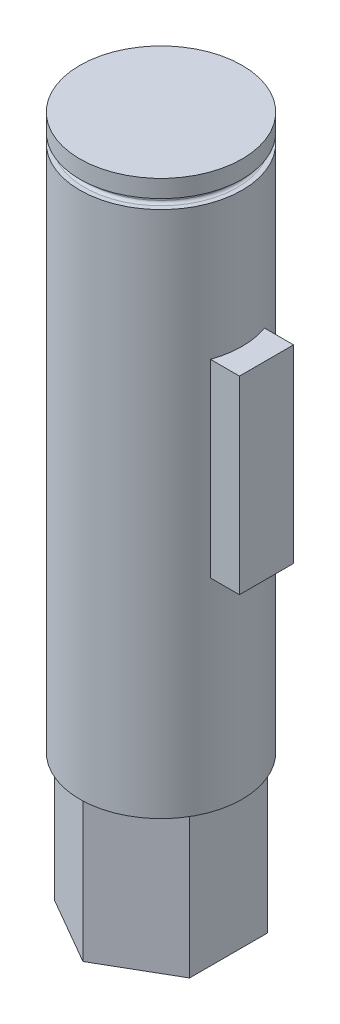
ISO-10303-21;
HEADER;
FILE_DESCRIPTION(('STEP AP214'),'2;1');
FILE_NAME('part.step','',(''),(''),'','','');
FILE_SCHEMA(('AUTOMOTIVE_DESIGN { 1 0 10303 214 1 1 1 1 }'));
ENDSEC;
DATA;
#1=APPLICATION_CONTEXT('core data for automotive mechanical design processes');
#2=APPLICATION_PROTOCOL_DEFINITION('international standard','automotive_design',2000,#1);
#3=PRODUCT_CONTEXT('',#1,'mechanical');
#4=PRODUCT('Part','Part','',(#3));
#5=PRODUCT_RELATED_PRODUCT_CATEGORY('part','',(#4));
#6=PRODUCT_DEFINITION_FORMATION('','',#4);
#7=PRODUCT_DEFINITION_CONTEXT('part definition',#1,'design');
#8=PRODUCT_DEFINITION('design','',#6,#7);
#9=PRODUCT_DEFINITION_SHAPE('','',#8);
#10=(LENGTH_UNIT() NAMED_UNIT(*) SI_UNIT(.MILLI.,.METRE.));
#11=(NAMED_UNIT(*) PLANE_ANGLE_UNIT() SI_UNIT($,.RADIAN.));
#12=(NAMED_UNIT(*) SI_UNIT($,.STERADIAN.) SOLID_ANGLE_UNIT());
#13=UNCERTAINTY_MEASURE_WITH_UNIT(LENGTH_MEASURE(1.E-05),#10,'distance_accuracy_value','');
#14=(GEOMETRIC_REPRESENTATION_CONTEXT(3) GLOBAL_UNCERTAINTY_ASSIGNED_CONTEXT((#13)) GLOBAL_UNIT_ASSIGNED_CONTEXT((#10,
#11,#12)) REPRESENTATION_CONTEXT('',''));
#15=CARTESIAN_POINT('',(0.,0.,0.));
#16=DIRECTION('',(0.,0.,1.));
#17=DIRECTION('',(1.,0.,0.));
#18=AXIS2_PLACEMENT_3D('',#15,#16,#17);
#19=CARTESIAN_POINT('',(0.,14.,0.));
#20=DIRECTION('',(0.,-1.,0.));
#21=DIRECTION('',(0.,0.,-1.));
#22=AXIS2_PLACEMENT_3D('',#19,#20,#21);
#23=CYLINDRICAL_SURFACE('',#22,6.);
#24=CARTESIAN_POINT('',(0.,-15.,0.));
#25=DIRECTION('',(0.,-1.,0.));
#26=DIRECTION('',(0.,0.,-1.));
#27=AXIS2_PLACEMENT_3D('',#24,#25,#26);
#28=CIRCLE('',#27,6.);
#29=CARTESIAN_POINT('',(0.,-15.,-6.));
#30=VERTEX_POINT('',#29);
#31=EDGE_CURVE('E191',#30,#30,#28,.T.);
#32=ORIENTED_EDGE('',*,*,#31,.F.);
#33=EDGE_LOOP('',(#32));
#34=FACE_BOUND('',#33,.T.);
#35=DIRECTION('',(0.,-1.,0.));
#36=VECTOR('',#35,1.);
#37=CARTESIAN_POINT('',(5.65685424949238,14.,-2.));
#38=LINE('',#37,#36);
#39=CARTESIAN_POINT('',(5.65685424949238,14.,-2.));
#40=VERTEX_POINT('',#39);
#41=CARTESIAN_POINT('',(5.65685424949238,0.,-2.));
#42=VERTEX_POINT('',#41);
#43=EDGE_CURVE('E210',#40,#42,#38,.T.);
#44=ORIENTED_EDGE('',*,*,#43,.T.);
#45=CARTESIAN_POINT('',(0.,0.,0.));
#46=DIRECTION('',(0.,-1.,0.));
#47=DIRECTION('',(0.,0.,-1.));
#48=AXIS2_PLACEMENT_3D('',#45,#46,#47);
#49=CIRCLE('',#48,6.);
#50=CARTESIAN_POINT('',(5.65685424949238,0.,2.));
#51=VERTEX_POINT('',#50);
#52=EDGE_CURVE('E195',#42,#51,#49,.T.);
#53=ORIENTED_EDGE('',*,*,#52,.T.);
#54=DIRECTION('',(0.,-1.,0.));
#55=VECTOR('',#54,1.);
#56=CARTESIAN_POINT('',(5.65685424949238,14.,2.));
#57=LINE('',#56,#55);
#58=CARTESIAN_POINT('',(5.65685424949238,14.,2.));
#59=VERTEX_POINT('',#58);
#60=EDGE_CURVE('E11',#59,#51,#57,.T.);
#61=ORIENTED_EDGE('',*,*,#60,.F.);
#62=CARTESIAN_POINT('',(0.,14.,0.));
#63=DIRECTION('',(0.,1.,0.));
#64=DIRECTION('',(0.,0.,1.));
#65=AXIS2_PLACEMENT_3D('',#62,#63,#64);
#66=CIRCLE('',#65,6.);
#67=EDGE_CURVE('E194',#59,#40,#66,.T.);
#68=ORIENTED_EDGE('',*,*,#67,.T.);
#69=EDGE_LOOP('',(#44,#53,#61,#68));
#70=FACE_BOUND('',#69,.T.);
#71=CARTESIAN_POINT('',(0.,24.,0.));
#72=DIRECTION('',(0.,1.,0.));
#73=DIRECTION('',(0.,0.,1.));
#74=AXIS2_PLACEMENT_3D('',#71,#72,#73);
#75=CIRCLE('',#74,6.);
#76=CARTESIAN_POINT('',(0.,24.,6.));
#77=VERTEX_POINT('',#76);
#78=EDGE_CURVE('E190',#77,#77,#75,.T.);
#79=ORIENTED_EDGE('',*,*,#78,.F.);
#80=EDGE_LOOP('',(#79));
#81=FACE_BOUND('',#80,.T.);
#82=ADVANCED_FACE('F41',(#34,#70,#81),#23,.T.);
#83=CARTESIAN_POINT('',(0.,0.,0.));
#84=DIRECTION('',(0.,1.,0.));
#85=DIRECTION('',(0.,0.,1.));
#86=AXIS2_PLACEMENT_3D('',#83,#84,#85);
#87=PLANE('',#86);
#88=ORIENTED_EDGE('',*,*,#52,.F.);
#89=DIRECTION('',(-1.,0.,0.));
#90=VECTOR('',#89,1.);
#91=CARTESIAN_POINT('',(7.8,0.,-2.));
#92=LINE('',#91,#90);
#93=CARTESIAN_POINT('',(7.8,0.,-2.));
#94=VERTEX_POINT('',#93);
#95=EDGE_CURVE('E206',#94,#42,#92,.T.);
#96=ORIENTED_EDGE('',*,*,#95,.F.);
#97=DIRECTION('',(0.,0.,-1.));
#98=VECTOR('',#97,1.);
#99=CARTESIAN_POINT('',(7.8,0.,2.));
#100=LINE('',#99,#98);
#101=CARTESIAN_POINT('',(7.8,0.,2.));
#102=VERTEX_POINT('',#101);
#103=EDGE_CURVE('E212',#102,#94,#100,.T.);
#104=ORIENTED_EDGE('',*,*,#103,.F.);
#105=DIRECTION('',(1.,0.,0.));
#106=VECTOR('',#105,1.);
#107=CARTESIAN_POINT('',(7.8,0.,2.));
#108=LINE('',#107,#106);
#109=EDGE_CURVE('E200',#51,#102,#108,.T.);
#110=ORIENTED_EDGE('',*,*,#109,.F.);
#111=EDGE_LOOP('',(#88,#96,#104,#110));
#112=FACE_BOUND('',#111,.T.);
#113=ADVANCED_FACE('F246',(#112),#87,.F.);
#114=CARTESIAN_POINT('',(7.8,14.,2.));
#115=DIRECTION('',(0.,0.,-1.));
#116=DIRECTION('',(-1.,0.,0.));
#117=AXIS2_PLACEMENT_3D('',#114,#115,#116);
#118=PLANE('',#117);
#119=ORIENTED_EDGE('',*,*,#109,.T.);
#120=DIRECTION('',(0.,-1.,0.));
#121=VECTOR('',#120,1.);
#122=CARTESIAN_POINT('',(7.8,14.,2.));
#123=LINE('',#122,#121);
#124=CARTESIAN_POINT('',(7.8,14.,2.));
#125=VERTEX_POINT('',#124);
#126=EDGE_CURVE('E50',#125,#102,#123,.T.);
#127=ORIENTED_EDGE('',*,*,#126,.F.);
#128=DIRECTION('',(1.,0.,0.));
#129=VECTOR('',#128,1.);
#130=CARTESIAN_POINT('',(7.8,14.,2.));
#131=LINE('',#130,#129);
#132=EDGE_CURVE('E203',#59,#125,#131,.T.);
#133=ORIENTED_EDGE('',*,*,#132,.F.);
#134=ORIENTED_EDGE('',*,*,#60,.T.);
#135=EDGE_LOOP('',(#119,#127,#133,#134));
#136=FACE_BOUND('',#135,.T.);
#137=ADVANCED_FACE('F251',(#136),#118,.F.);
#138=CARTESIAN_POINT('',(7.8,14.,2.));
#139=DIRECTION('',(-1.,0.,0.));
#140=DIRECTION('',(0.,0.,1.));
#141=AXIS2_PLACEMENT_3D('',#138,#139,#140);
#142=PLANE('',#141);
#143=ORIENTED_EDGE('',*,*,#103,.T.);
#144=DIRECTION('',(0.,-1.,0.));
#145=VECTOR('',#144,1.);
#146=CARTESIAN_POINT('',(7.8,14.,-2.));
#147=LINE('',#146,#145);
#148=CARTESIAN_POINT('',(7.8,14.,-2.));
#149=VERTEX_POINT('',#148);
#150=EDGE_CURVE('E218',#149,#94,#147,.T.);
#151=ORIENTED_EDGE('',*,*,#150,.F.);
#152=DIRECTION('',(0.,0.,-1.));
#153=VECTOR('',#152,1.);
#154=CARTESIAN_POINT('',(7.8,14.,2.));
#155=LINE('',#154,#153);
#156=EDGE_CURVE('E205',#125,#149,#155,.T.);
#157=ORIENTED_EDGE('',*,*,#156,.F.);
#158=ORIENTED_EDGE('',*,*,#126,.T.);
#159=EDGE_LOOP('',(#143,#151,#157,#158));
#160=FACE_BOUND('',#159,.T.);
#161=ADVANCED_FACE('F273',(#160),#142,.F.);
#162=CARTESIAN_POINT('',(7.8,14.,-2.));
#163=DIRECTION('',(0.,0.,1.));
#164=DIRECTION('',(1.,0.,0.));
#165=AXIS2_PLACEMENT_3D('',#162,#163,#164);
#166=PLANE('',#165);
#167=ORIENTED_EDGE('',*,*,#95,.T.);
#168=ORIENTED_EDGE('',*,*,#43,.F.);
#169=DIRECTION('',(-1.,0.,0.));
#170=VECTOR('',#169,1.);
#171=CARTESIAN_POINT('',(7.8,14.,-2.));
#172=LINE('',#171,#170);
#173=EDGE_CURVE('E208',#149,#40,#172,.T.);
#174=ORIENTED_EDGE('',*,*,#173,.F.);
#175=ORIENTED_EDGE('',*,*,#150,.T.);
#176=EDGE_LOOP('',(#167,#168,#174,#175));
#177=FACE_BOUND('',#176,.T.);
#178=ADVANCED_FACE('F262',(#177),#166,.F.);
#179=CARTESIAN_POINT('',(0.,14.,0.));
#180=DIRECTION('',(0.,1.,0.));
#181=DIRECTION('',(0.,0.,1.));
#182=AXIS2_PLACEMENT_3D('',#179,#180,#181);
#183=PLANE('',#182);
#184=ORIENTED_EDGE('',*,*,#67,.F.);
#185=ORIENTED_EDGE('',*,*,#132,.T.);
#186=ORIENTED_EDGE('',*,*,#156,.T.);
#187=ORIENTED_EDGE('',*,*,#173,.T.);
#188=EDGE_LOOP('',(#184,#185,#186,#187));
#189=FACE_BOUND('',#188,.T.);
#190=ADVANCED_FACE('F271',(#189),#183,.T.);
#191=CARTESIAN_POINT('',(0.,-15.,0.));
#192=DIRECTION('',(0.,-1.,0.));
#193=DIRECTION('',(0.,0.,-1.));
#194=AXIS2_PLACEMENT_3D('',#191,#192,#193);
#195=PLANE('',#194);
#196=DIRECTION('',(-0.866025403784439,0.,0.5));
#197=VECTOR('',#196,1.);
#198=CARTESIAN_POINT('',(5.,-15.,2.88675134594813));
#199=LINE('',#198,#197);
#200=CARTESIAN_POINT('',(5.,-15.,2.88675134594813));
#201=VERTEX_POINT('',#200);
#202=CARTESIAN_POINT('',(0.,-15.,5.77350269189626));
#203=VERTEX_POINT('',#202);
#204=EDGE_CURVE('E58',#201,#203,#199,.T.);
#205=ORIENTED_EDGE('',*,*,#204,.F.);
#206=DIRECTION('',(0.,0.,1.));
#207=VECTOR('',#206,1.);
#208=CARTESIAN_POINT('',(5.,-15.,-2.88675134594813));
#209=LINE('',#208,#207);
#210=CARTESIAN_POINT('',(5.,-15.,-2.88675134594813));
#211=VERTEX_POINT('',#210);
#212=EDGE_CURVE('E62',#211,#201,#209,.T.);
#213=ORIENTED_EDGE('',*,*,#212,.F.);
#214=DIRECTION('',(0.866025403784438,0.,0.5));
#215=VECTOR('',#214,1.);
#216=CARTESIAN_POINT('',(0.,-15.,-5.77350269189626));
#217=LINE('',#216,#215);
#218=CARTESIAN_POINT('',(0.,-15.,-5.77350269189626));
#219=VERTEX_POINT('',#218);
#220=EDGE_CURVE('E158',#219,#211,#217,.T.);
#221=ORIENTED_EDGE('',*,*,#220,.F.);
#222=DIRECTION('',(0.866025403784438,0.,-0.5));
#223=VECTOR('',#222,1.);
#224=CARTESIAN_POINT('',(-5.,-15.,-2.88675134594813));
#225=LINE('',#224,#223);
#226=CARTESIAN_POINT('',(-5.,-15.,-2.88675134594813));
#227=VERTEX_POINT('',#226);
#228=EDGE_CURVE('E155',#227,#219,#225,.T.);
#229=ORIENTED_EDGE('',*,*,#228,.F.);
#230=DIRECTION('',(0.,0.,-1.));
#231=VECTOR('',#230,1.);
#232=CARTESIAN_POINT('',(-5.,-15.,2.88675134594813));
#233=LINE('',#232,#231);
#234=CARTESIAN_POINT('',(-5.,-15.,2.88675134594813));
#235=VERTEX_POINT('',#234);
#236=EDGE_CURVE('E152',#235,#227,#233,.T.);
#237=ORIENTED_EDGE('',*,*,#236,.F.);
#238=DIRECTION('',(-0.866025403784438,0.,-0.5));
#239=VECTOR('',#238,1.);
#240=CARTESIAN_POINT('',(0.,-15.,5.77350269189626));
#241=LINE('',#240,#239);
#242=EDGE_CURVE('E131',#203,#235,#241,.T.);
#243=ORIENTED_EDGE('',*,*,#242,.F.);
#244=EDGE_LOOP('',(#205,#213,#221,#229,#237,#243));
#245=FACE_BOUND('',#244,.T.);
#246=ORIENTED_EDGE('',*,*,#31,.T.);
#247=EDGE_LOOP('',(#246));
#248=FACE_BOUND('',#247,.T.);
#249=ADVANCED_FACE('F283',(#245,#248),#195,.T.);
#250=CARTESIAN_POINT('',(-5.5030110244233,24.7,-1.28037871939337));
#251=DIRECTION('',(0.,-1.,0.));
#252=DIRECTION('',(0.,0.,-1.));
#253=AXIS2_PLACEMENT_3D('',#250,#251,#252);
#254=PLANE('',#253);
#255=CARTESIAN_POINT('',(0.,24.7,0.));
#256=DIRECTION('',(0.,-1.,0.));
#257=DIRECTION('',(0.,0.,-1.));
#258=AXIS2_PLACEMENT_3D('',#255,#256,#257);
#259=CIRCLE('',#258,5.64999999999998);
#260=CARTESIAN_POINT('',(0.,24.7,-5.64999999999998));
#261=VERTEX_POINT('',#260);
#262=EDGE_CURVE('E187',#261,#261,#259,.T.);
#263=ORIENTED_EDGE('',*,*,#262,.F.);
#264=EDGE_LOOP('',(#263));
#265=FACE_BOUND('',#264,.T.);
#266=CARTESIAN_POINT('',(0.,24.7,0.));
#267=DIRECTION('',(0.,-1.,0.));
#268=DIRECTION('',(0.,0.,-1.));
#269=AXIS2_PLACEMENT_3D('',#266,#267,#268);
#270=CIRCLE('',#269,6.);
#271=CARTESIAN_POINT('',(0.,24.7,-6.));
#272=VERTEX_POINT('',#271);
#273=EDGE_CURVE('E45',#272,#272,#270,.T.);
#274=ORIENTED_EDGE('',*,*,#273,.T.);
#275=EDGE_LOOP('',(#274));
#276=FACE_BOUND('',#275,.T.);
#277=ADVANCED_FACE('F228',(#265,#276),#254,.T.);
#278=CARTESIAN_POINT('',(-6.98833700889154,24.,-1.6259676657783));
#279=DIRECTION('',(0.,1.,0.));
#280=DIRECTION('',(0.,0.,1.));
#281=AXIS2_PLACEMENT_3D('',#278,#279,#280);
#282=PLANE('',#281);
#283=CARTESIAN_POINT('',(0.,24.,0.));
#284=DIRECTION('',(0.,-1.,0.));
#285=DIRECTION('',(0.,0.,-1.));
#286=AXIS2_PLACEMENT_3D('',#283,#284,#285);
#287=CIRCLE('',#286,5.64999999999998);
#288=CARTESIAN_POINT('',(0.,24.,-5.64999999999998));
#289=VERTEX_POINT('',#288);
#290=EDGE_CURVE('E178',#289,#289,#287,.T.);
#291=ORIENTED_EDGE('',*,*,#290,.T.);
#292=EDGE_LOOP('',(#291));
#293=FACE_BOUND('',#292,.T.);
#294=ORIENTED_EDGE('',*,*,#78,.T.);
#295=EDGE_LOOP('',(#294));
#296=FACE_BOUND('',#295,.T.);
#297=ADVANCED_FACE('F289',(#293,#296),#282,.T.);
#298=CARTESIAN_POINT('',(0.,24.5,0.));
#299=DIRECTION('',(0.,-1.,0.));
#300=DIRECTION('',(0.,0.,-1.));
#301=AXIS2_PLACEMENT_3D('',#298,#299,#300);
#302=TOROIDAL_SURFACE('',#301,5.64999999999998,0.199999999999999);
#303=ORIENTED_EDGE('',*,*,#262,.T.);
#304=EDGE_LOOP('',(#303));
#305=FACE_BOUND('',#304,.T.);
#306=CARTESIAN_POINT('',(0.,24.5,0.));
#307=DIRECTION('',(0.,-1.,0.));
#308=DIRECTION('',(0.,0.,-1.));
#309=AXIS2_PLACEMENT_3D('',#306,#307,#308);
#310=CIRCLE('',#309,5.44999999999998);
#311=CARTESIAN_POINT('',(0.,24.5,-5.44999999999998));
#312=VERTEX_POINT('',#311);
#313=EDGE_CURVE('E184',#312,#312,#310,.T.);
#314=ORIENTED_EDGE('',*,*,#313,.F.);
#315=EDGE_LOOP('',(#314));
#316=FACE_BOUND('',#315,.T.);
#317=ADVANCED_FACE('F291',(#305,#316),#302,.F.);
#318=CARTESIAN_POINT('',(0.,60.2246155762171,0.));
#319=DIRECTION('',(0.,-1.,0.));
#320=DIRECTION('',(0.,0.,-1.));
#321=AXIS2_PLACEMENT_3D('',#318,#319,#320);
#322=CYLINDRICAL_SURFACE('',#321,5.44999999999998);
#323=ORIENTED_EDGE('',*,*,#313,.T.);
#324=EDGE_LOOP('',(#323));
#325=FACE_BOUND('',#324,.T.);
#326=CARTESIAN_POINT('',(0.,24.2,0.));
#327=DIRECTION('',(0.,-1.,0.));
#328=DIRECTION('',(0.,0.,-1.));
#329=AXIS2_PLACEMENT_3D('',#326,#327,#328);
#330=CIRCLE('',#329,5.44999999999998);
#331=CARTESIAN_POINT('',(0.,24.2,-5.44999999999998));
#332=VERTEX_POINT('',#331);
#333=EDGE_CURVE('E181',#332,#332,#330,.T.);
#334=ORIENTED_EDGE('',*,*,#333,.F.);
#335=EDGE_LOOP('',(#334));
#336=FACE_BOUND('',#335,.T.);
#337=ADVANCED_FACE('F294',(#325,#336),#322,.T.);
#338=CARTESIAN_POINT('',(0.,24.2,0.));
#339=DIRECTION('',(0.,-1.,0.));
#340=DIRECTION('',(0.,0.,-1.));
#341=AXIS2_PLACEMENT_3D('',#338,#339,#340);
#342=TOROIDAL_SURFACE('',#341,5.64999999999998,0.199999999999998);
#343=ORIENTED_EDGE('',*,*,#333,.T.);
#344=EDGE_LOOP('',(#343));
#345=FACE_BOUND('',#344,.T.);
#346=ORIENTED_EDGE('',*,*,#290,.F.);
#347=EDGE_LOOP('',(#346));
#348=FACE_BOUND('',#347,.T.);
#349=ADVANCED_FACE('F241',(#345,#348),#342,.F.);
#350=CARTESIAN_POINT('',(0.,26.,0.));
#351=DIRECTION('',(0.,1.,0.));
#352=DIRECTION('',(0.,0.,1.));
#353=AXIS2_PLACEMENT_3D('',#350,#351,#352);
#354=PLANE('',#353);
#355=CARTESIAN_POINT('',(0.,26.,0.));
#356=DIRECTION('',(0.,1.,0.));
#357=DIRECTION('',(0.,0.,1.));
#358=AXIS2_PLACEMENT_3D('',#355,#356,#357);
#359=CIRCLE('',#358,6.);
#360=CARTESIAN_POINT('',(0.,26.,6.));
#361=VERTEX_POINT('',#360);
#362=EDGE_CURVE('E197',#361,#361,#359,.T.);
#363=ORIENTED_EDGE('',*,*,#362,.T.);
#364=EDGE_LOOP('',(#363));
#365=FACE_BOUND('',#364,.T.);
#366=ADVANCED_FACE('F232',(#365),#354,.T.);
#367=ORIENTED_EDGE('',*,*,#362,.F.);
#368=EDGE_LOOP('',(#367));
#369=FACE_BOUND('',#368,.T.);
#370=ORIENTED_EDGE('',*,*,#273,.F.);
#371=EDGE_LOOP('',(#370));
#372=FACE_BOUND('',#371,.T.);
#373=ADVANCED_FACE('F43',(#369,#372),#23,.T.);
#374=CARTESIAN_POINT('',(5.,-25.5,2.88675134594813));
#375=DIRECTION('',(-0.5,0.,-0.866025403784439));
#376=DIRECTION('',(-0.866025403784439,0.,0.5));
#377=AXIS2_PLACEMENT_3D('',#374,#375,#376);
#378=PLANE('',#377);
#379=ORIENTED_EDGE('',*,*,#204,.T.);
#380=DIRECTION('',(0.,1.,0.));
#381=VECTOR('',#380,1.);
#382=CARTESIAN_POINT('',(0.,-25.5,5.77350269189626));
#383=LINE('',#382,#381);
#384=CARTESIAN_POINT('',(0.,-25.5,5.77350269189626));
#385=VERTEX_POINT('',#384);
#386=EDGE_CURVE('E175',#385,#203,#383,.T.);
#387=ORIENTED_EDGE('',*,*,#386,.F.);
#388=DIRECTION('',(-0.866025403784439,0.,0.5));
#389=VECTOR('',#388,1.);
#390=CARTESIAN_POINT('',(5.,-25.5,2.88675134594813));
#391=LINE('',#390,#389);
#392=CARTESIAN_POINT('',(5.,-25.5,2.88675134594813));
#393=VERTEX_POINT('',#392);
#394=EDGE_CURVE('E136',#393,#385,#391,.T.);
#395=ORIENTED_EDGE('',*,*,#394,.F.);
#396=DIRECTION('',(0.,1.,0.));
#397=VECTOR('',#396,1.);
#398=CARTESIAN_POINT('',(5.,-25.5,2.88675134594813));
#399=LINE('',#398,#397);
#400=EDGE_CURVE('E148',#393,#201,#399,.T.);
#401=ORIENTED_EDGE('',*,*,#400,.T.);
#402=EDGE_LOOP('',(#379,#387,#395,#401));
#403=FACE_BOUND('',#402,.T.);
#404=ADVANCED_FACE('F231',(#403),#378,.F.);
#405=CARTESIAN_POINT('',(0.,-25.5,5.77350269189626));
#406=DIRECTION('',(0.5,0.,-0.866025403784439));
#407=DIRECTION('',(-0.866025403784438,0.,-0.5));
#408=AXIS2_PLACEMENT_3D('',#405,#406,#407);
#409=PLANE('',#408);
#410=ORIENTED_EDGE('',*,*,#242,.T.);
#411=DIRECTION('',(0.,1.,0.));
#412=VECTOR('',#411,1.);
#413=CARTESIAN_POINT('',(-5.,-25.5,2.88675134594813));
#414=LINE('',#413,#412);
#415=CARTESIAN_POINT('',(-5.,-25.5,2.88675134594813));
#416=VERTEX_POINT('',#415);
#417=EDGE_CURVE('E172',#416,#235,#414,.T.);
#418=ORIENTED_EDGE('',*,*,#417,.F.);
#419=DIRECTION('',(-0.866025403784438,0.,-0.5));
#420=VECTOR('',#419,1.);
#421=CARTESIAN_POINT('',(0.,-25.5,5.77350269189626));
#422=LINE('',#421,#420);
#423=EDGE_CURVE('E139',#385,#416,#422,.T.);
#424=ORIENTED_EDGE('',*,*,#423,.F.);
#425=ORIENTED_EDGE('',*,*,#386,.T.);
#426=EDGE_LOOP('',(#410,#418,#424,#425));
#427=FACE_BOUND('',#426,.T.);
#428=ADVANCED_FACE('F238',(#427),#409,.F.);
#429=CARTESIAN_POINT('',(-5.,-25.5,2.88675134594813));
#430=DIRECTION('',(1.,0.,0.));
#431=DIRECTION('',(0.,0.,-1.));
#432=AXIS2_PLACEMENT_3D('',#429,#430,#431);
#433=PLANE('',#432);
#434=ORIENTED_EDGE('',*,*,#236,.T.);
#435=DIRECTION('',(0.,1.,0.));
#436=VECTOR('',#435,1.);
#437=CARTESIAN_POINT('',(-5.,-25.5,-2.88675134594813));
#438=LINE('',#437,#436);
#439=CARTESIAN_POINT('',(-5.,-25.5,-2.88675134594813));
#440=VERTEX_POINT('',#439);
#441=EDGE_CURVE('E169',#440,#227,#438,.T.);
#442=ORIENTED_EDGE('',*,*,#441,.F.);
#443=DIRECTION('',(0.,0.,-1.));
#444=VECTOR('',#443,1.);
#445=CARTESIAN_POINT('',(-5.,-25.5,2.88675134594813));
#446=LINE('',#445,#444);
#447=EDGE_CURVE('E141',#416,#440,#446,.T.);
#448=ORIENTED_EDGE('',*,*,#447,.F.);
#449=ORIENTED_EDGE('',*,*,#417,.T.);
#450=EDGE_LOOP('',(#434,#442,#448,#449));
#451=FACE_BOUND('',#450,.T.);
#452=ADVANCED_FACE('F307',(#451),#433,.F.);
#453=CARTESIAN_POINT('',(-5.,-25.5,-2.88675134594813));
#454=DIRECTION('',(0.5,0.,0.866025403784438));
#455=DIRECTION('',(0.866025403784439,0.,-0.5));
#456=AXIS2_PLACEMENT_3D('',#453,#454,#455);
#457=PLANE('',#456);
#458=ORIENTED_EDGE('',*,*,#228,.T.);
#459=DIRECTION('',(0.,1.,0.));
#460=VECTOR('',#459,1.);
#461=CARTESIAN_POINT('',(0.,-25.5,-5.77350269189626));
#462=LINE('',#461,#460);
#463=CARTESIAN_POINT('',(0.,-25.5,-5.77350269189626));
#464=VERTEX_POINT('',#463);
#465=EDGE_CURVE('E166',#464,#219,#462,.T.);
#466=ORIENTED_EDGE('',*,*,#465,.F.);
#467=DIRECTION('',(0.866025403784438,0.,-0.5));
#468=VECTOR('',#467,1.);
#469=CARTESIAN_POINT('',(-5.,-25.5,-2.88675134594813));
#470=LINE('',#469,#468);
#471=EDGE_CURVE('E143',#440,#464,#470,.T.);
#472=ORIENTED_EDGE('',*,*,#471,.F.);
#473=ORIENTED_EDGE('',*,*,#441,.T.);
#474=EDGE_LOOP('',(#458,#466,#472,#473));
#475=FACE_BOUND('',#474,.T.);
#476=ADVANCED_FACE('F311',(#475),#457,.F.);
#477=CARTESIAN_POINT('',(0.,-25.5,-5.77350269189626));
#478=DIRECTION('',(-0.5,0.,0.866025403784439));
#479=DIRECTION('',(0.866025403784439,0.,0.5));
#480=AXIS2_PLACEMENT_3D('',#477,#478,#479);
#481=PLANE('',#480);
#482=ORIENTED_EDGE('',*,*,#220,.T.);
#483=DIRECTION('',(0.,1.,0.));
#484=VECTOR('',#483,1.);
#485=CARTESIAN_POINT('',(5.,-25.5,-2.88675134594813));
#486=LINE('',#485,#484);
#487=CARTESIAN_POINT('',(5.,-25.5,-2.88675134594813));
#488=VERTEX_POINT('',#487);
#489=EDGE_CURVE('E163',#488,#211,#486,.T.);
#490=ORIENTED_EDGE('',*,*,#489,.F.);
#491=DIRECTION('',(0.866025403784438,0.,0.5));
#492=VECTOR('',#491,1.);
#493=CARTESIAN_POINT('',(0.,-25.5,-5.77350269189626));
#494=LINE('',#493,#492);
#495=EDGE_CURVE('E145',#464,#488,#494,.T.);
#496=ORIENTED_EDGE('',*,*,#495,.F.);
#497=ORIENTED_EDGE('',*,*,#465,.T.);
#498=EDGE_LOOP('',(#482,#490,#496,#497));
#499=FACE_BOUND('',#498,.T.);
#500=ADVANCED_FACE('F315',(#499),#481,.F.);
#501=CARTESIAN_POINT('',(5.,-25.5,-2.88675134594813));
#502=DIRECTION('',(-1.,0.,0.));
#503=DIRECTION('',(0.,0.,1.));
#504=AXIS2_PLACEMENT_3D('',#501,#502,#503);
#505=PLANE('',#504);
#506=ORIENTED_EDGE('',*,*,#212,.T.);
#507=ORIENTED_EDGE('',*,*,#400,.F.);
#508=DIRECTION('',(0.,0.,1.));
#509=VECTOR('',#508,1.);
#510=CARTESIAN_POINT('',(5.,-25.5,-2.88675134594813));
#511=LINE('',#510,#509);
#512=EDGE_CURVE('E147',#488,#393,#511,.T.);
#513=ORIENTED_EDGE('',*,*,#512,.F.);
#514=ORIENTED_EDGE('',*,*,#489,.T.);
#515=EDGE_LOOP('',(#506,#507,#513,#514));
#516=FACE_BOUND('',#515,.T.);
#517=ADVANCED_FACE('F319',(#516),#505,.F.);
#518=CARTESIAN_POINT('',(0.,-25.5,0.));
#519=DIRECTION('',(0.,-1.,0.));
#520=DIRECTION('',(0.,0.,-1.));
#521=AXIS2_PLACEMENT_3D('',#518,#519,#520);
#522=PLANE('',#521);
#523=CARTESIAN_POINT('',(0.,-25.5,0.));
#524=DIRECTION('',(0.,-1.,0.));
#525=DIRECTION('',(0.,0.,-1.));
#526=AXIS2_PLACEMENT_3D('',#523,#524,#525);
#527=CIRCLE('',#526,1.65);
#528=CARTESIAN_POINT('',(0.,-25.5,-1.65));
#529=VERTEX_POINT('',#528);
#530=EDGE_CURVE('E129',#529,#529,#527,.T.);
#531=ORIENTED_EDGE('',*,*,#530,.F.);
#532=EDGE_LOOP('',(#531));
#533=FACE_BOUND('',#532,.T.);
#534=ORIENTED_EDGE('',*,*,#394,.T.);
#535=ORIENTED_EDGE('',*,*,#423,.T.);
#536=ORIENTED_EDGE('',*,*,#447,.T.);
#537=ORIENTED_EDGE('',*,*,#471,.T.);
#538=ORIENTED_EDGE('',*,*,#495,.T.);
#539=ORIENTED_EDGE('',*,*,#512,.T.);
#540=EDGE_LOOP('',(#534,#535,#536,#537,#538,#539));
#541=FACE_BOUND('',#540,.T.);
#542=ADVANCED_FACE('F123',(#533,#541),#522,.T.);
#543=CARTESIAN_POINT('',(0.,-15.4,0.));
#544=DIRECTION('',(0.,-1.,0.));
#545=DIRECTION('',(0.,0.,-1.));
#546=AXIS2_PLACEMENT_3D('',#543,#544,#545);
#547=CONICAL_SURFACE('',#546,1.65,1.02974425867665);
#548=CARTESIAN_POINT('',(0.,-14.4085799786045,0.));
#549=VERTEX_POINT('',#548);
#550=VERTEX_LOOP('',#549);
#551=FACE_BOUND('',#550,.T.);
#552=CARTESIAN_POINT('',(0.,-15.4,0.));
#553=DIRECTION('',(0.,-1.,0.));
#554=DIRECTION('',(0.,0.,-1.));
#555=AXIS2_PLACEMENT_3D('',#552,#553,#554);
#556=CIRCLE('',#555,1.65);
#557=CARTESIAN_POINT('',(0.,-15.4,-1.65));
#558=VERTEX_POINT('',#557);
#559=EDGE_CURVE('E127',#558,#558,#556,.T.);
#560=ORIENTED_EDGE('',*,*,#559,.T.);
#561=EDGE_LOOP('',(#560));
#562=FACE_BOUND('',#561,.T.);
#563=ADVANCED_FACE('F119',(#551,#562),#547,.F.);
#564=CARTESIAN_POINT('',(0.,-25.5,0.));
#565=DIRECTION('',(0.,-1.,0.));
#566=DIRECTION('',(0.,0.,-1.));
#567=AXIS2_PLACEMENT_3D('',#564,#565,#566);
#568=CYLINDRICAL_SURFACE('',#567,1.65);
#569=ORIENTED_EDGE('',*,*,#559,.F.);
#570=EDGE_LOOP('',(#569));
#571=FACE_BOUND('',#570,.T.);
#572=ORIENTED_EDGE('',*,*,#530,.T.);
#573=EDGE_LOOP('',(#572));
#574=FACE_BOUND('',#573,.T.);
#575=ADVANCED_FACE('F122',(#571,#574),#568,.F.);
#576=CLOSED_SHELL('',(#82,#113,#137,#161,#178,#190,#249,#277,#297,#317,#337,#349,#366,#373,#404,
#428,#452,#476,#500,#517,#542,#563,#575));
#577=MANIFOLD_SOLID_BREP('B2',#576);
#578=ADVANCED_BREP_SHAPE_REPRESENTATION('',(#18,#577),#14);
#579=SHAPE_DEFINITION_REPRESENTATION(#9,#578);
ENDSEC;
END-ISO-10303-21;
